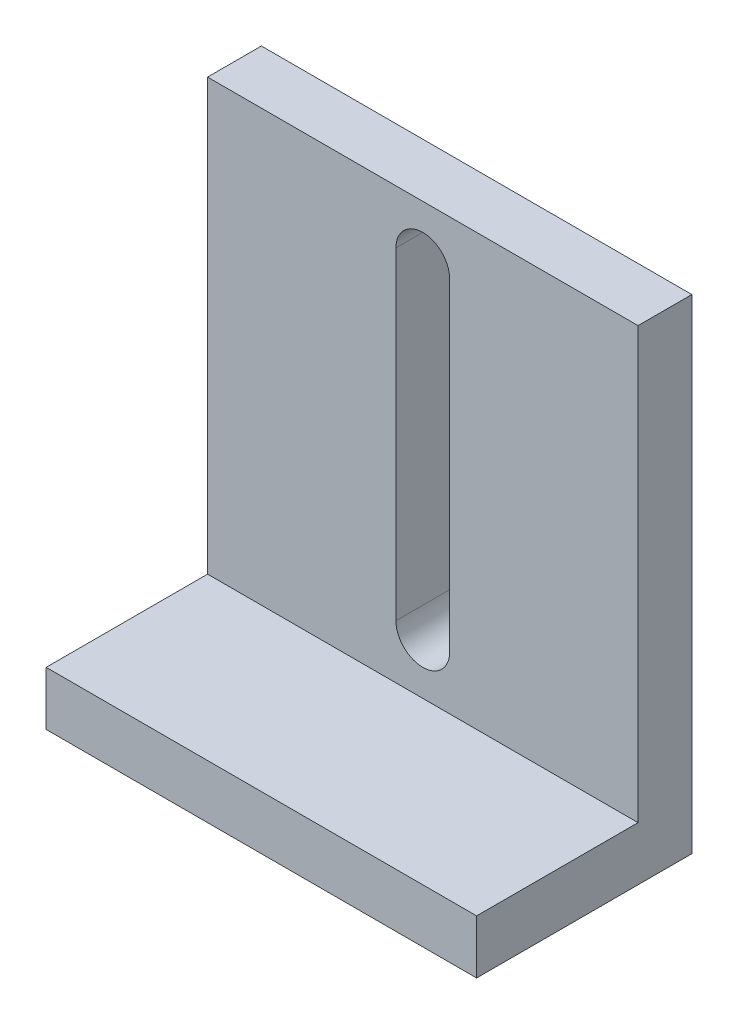
ISO-10303-21;
HEADER;
FILE_DESCRIPTION(('STEP AP214'),'2;1');
FILE_NAME('part.step','',(''),(''),'','','');
FILE_SCHEMA(('AUTOMOTIVE_DESIGN { 1 0 10303 214 1 1 1 1 }'));
ENDSEC;
DATA;
#1=APPLICATION_CONTEXT('core data for automotive mechanical design processes');
#2=APPLICATION_PROTOCOL_DEFINITION('international standard','automotive_design',2000,#1);
#3=PRODUCT_CONTEXT('',#1,'mechanical');
#4=PRODUCT('Part','Part','',(#3));
#5=PRODUCT_RELATED_PRODUCT_CATEGORY('part','',(#4));
#6=PRODUCT_DEFINITION_FORMATION('','',#4);
#7=PRODUCT_DEFINITION_CONTEXT('part definition',#1,'design');
#8=PRODUCT_DEFINITION('design','',#6,#7);
#9=PRODUCT_DEFINITION_SHAPE('','',#8);
#10=(LENGTH_UNIT() NAMED_UNIT(*) SI_UNIT(.MILLI.,.METRE.));
#11=(NAMED_UNIT(*) PLANE_ANGLE_UNIT() SI_UNIT($,.RADIAN.));
#12=(NAMED_UNIT(*) SI_UNIT($,.STERADIAN.) SOLID_ANGLE_UNIT());
#13=UNCERTAINTY_MEASURE_WITH_UNIT(LENGTH_MEASURE(1.E-05),#10,'distance_accuracy_value','');
#14=(GEOMETRIC_REPRESENTATION_CONTEXT(3) GLOBAL_UNCERTAINTY_ASSIGNED_CONTEXT((#13)) GLOBAL_UNIT_ASSIGNED_CONTEXT((#10,
#11,#12)) REPRESENTATION_CONTEXT('',''));
#15=CARTESIAN_POINT('',(0.,0.,0.));
#16=DIRECTION('',(0.,0.,1.));
#17=DIRECTION('',(1.,0.,0.));
#18=AXIS2_PLACEMENT_3D('',#15,#16,#17);
#19=CARTESIAN_POINT('',(-12.7,3.175,6.35));
#20=DIRECTION('',(1.,0.,0.));
#21=DIRECTION('',(0.,0.,-1.));
#22=AXIS2_PLACEMENT_3D('',#19,#20,#21);
#23=PLANE('',#22);
#24=DIRECTION('',(0.,0.,1.));
#25=VECTOR('',#24,1.);
#26=CARTESIAN_POINT('',(-12.7,0.,6.35));
#27=LINE('',#26,#25);
#28=CARTESIAN_POINT('',(-12.7,0.,-6.35));
#29=VERTEX_POINT('',#28);
#30=CARTESIAN_POINT('',(-12.7,0.,6.35));
#31=VERTEX_POINT('',#30);
#32=EDGE_CURVE('E164',#29,#31,#27,.T.);
#33=ORIENTED_EDGE('',*,*,#32,.T.);
#34=DIRECTION('',(0.,-1.,0.));
#35=VECTOR('',#34,1.);
#36=CARTESIAN_POINT('',(-12.7,3.175,6.35));
#37=LINE('',#36,#35);
#38=CARTESIAN_POINT('',(-12.7,3.175,6.35));
#39=VERTEX_POINT('',#38);
#40=EDGE_CURVE('E11',#39,#31,#37,.T.);
#41=ORIENTED_EDGE('',*,*,#40,.F.);
#42=DIRECTION('',(0.,0.,1.));
#43=VECTOR('',#42,1.);
#44=CARTESIAN_POINT('',(-12.7,3.175,6.35));
#45=LINE('',#44,#43);
#46=CARTESIAN_POINT('',(-12.7,3.175,-3.175));
#47=VERTEX_POINT('',#46);
#48=EDGE_CURVE('E165',#47,#39,#45,.T.);
#49=ORIENTED_EDGE('',*,*,#48,.F.);
#50=DIRECTION('',(0.,-1.,0.));
#51=VECTOR('',#50,1.);
#52=CARTESIAN_POINT('',(-12.7,28.575,-3.175));
#53=LINE('',#52,#51);
#54=CARTESIAN_POINT('',(-12.7,28.575,-3.175));
#55=VERTEX_POINT('',#54);
#56=EDGE_CURVE('E161',#55,#47,#53,.T.);
#57=ORIENTED_EDGE('',*,*,#56,.F.);
#58=DIRECTION('',(0.,0.,1.));
#59=VECTOR('',#58,1.);
#60=CARTESIAN_POINT('',(-12.7,28.575,-6.35));
#61=LINE('',#60,#59);
#62=CARTESIAN_POINT('',(-12.7,28.575,-6.35));
#63=VERTEX_POINT('',#62);
#64=EDGE_CURVE('E145',#63,#55,#61,.T.);
#65=ORIENTED_EDGE('',*,*,#64,.F.);
#66=DIRECTION('',(0.,-1.,0.));
#67=VECTOR('',#66,1.);
#68=CARTESIAN_POINT('',(-12.7,3.175,-6.35));
#69=LINE('',#68,#67);
#70=EDGE_CURVE('E172',#63,#29,#69,.T.);
#71=ORIENTED_EDGE('',*,*,#70,.T.);
#72=EDGE_LOOP('',(#33,#41,#49,#57,#65,#71));
#73=FACE_BOUND('',#72,.T.);
#74=ADVANCED_FACE('F32',(#73),#23,.F.);
#75=CARTESIAN_POINT('',(12.7,3.175,6.35));
#76=DIRECTION('',(0.,0.,-1.));
#77=DIRECTION('',(-1.,0.,0.));
#78=AXIS2_PLACEMENT_3D('',#75,#76,#77);
#79=PLANE('',#78);
#80=DIRECTION('',(1.,0.,0.));
#81=VECTOR('',#80,1.);
#82=CARTESIAN_POINT('',(12.7,0.,6.35));
#83=LINE('',#82,#81);
#84=CARTESIAN_POINT('',(12.7,0.,6.35));
#85=VERTEX_POINT('',#84);
#86=EDGE_CURVE('E175',#31,#85,#83,.T.);
#87=ORIENTED_EDGE('',*,*,#86,.T.);
#88=DIRECTION('',(0.,-1.,0.));
#89=VECTOR('',#88,1.);
#90=CARTESIAN_POINT('',(12.7,3.175,6.35));
#91=LINE('',#90,#89);
#92=CARTESIAN_POINT('',(12.7,3.175,6.35));
#93=VERTEX_POINT('',#92);
#94=EDGE_CURVE('E39',#93,#85,#91,.T.);
#95=ORIENTED_EDGE('',*,*,#94,.F.);
#96=DIRECTION('',(1.,0.,0.));
#97=VECTOR('',#96,1.);
#98=CARTESIAN_POINT('',(12.7,3.175,6.35));
#99=LINE('',#98,#97);
#100=EDGE_CURVE('E167',#39,#93,#99,.T.);
#101=ORIENTED_EDGE('',*,*,#100,.F.);
#102=ORIENTED_EDGE('',*,*,#40,.T.);
#103=EDGE_LOOP('',(#87,#95,#101,#102));
#104=FACE_BOUND('',#103,.T.);
#105=ADVANCED_FACE('F210',(#104),#79,.F.);
#106=CARTESIAN_POINT('',(12.7,3.175,6.35));
#107=DIRECTION('',(-1.,0.,0.));
#108=DIRECTION('',(0.,0.,1.));
#109=AXIS2_PLACEMENT_3D('',#106,#107,#108);
#110=PLANE('',#109);
#111=DIRECTION('',(0.,0.,-1.));
#112=VECTOR('',#111,1.);
#113=CARTESIAN_POINT('',(12.7,0.,6.35));
#114=LINE('',#113,#112);
#115=CARTESIAN_POINT('',(12.7,0.,-6.35));
#116=VERTEX_POINT('',#115);
#117=EDGE_CURVE('E177',#85,#116,#114,.T.);
#118=ORIENTED_EDGE('',*,*,#117,.T.);
#119=DIRECTION('',(0.,-1.,0.));
#120=VECTOR('',#119,1.);
#121=CARTESIAN_POINT('',(12.7,3.175,-6.35));
#122=LINE('',#121,#120);
#123=CARTESIAN_POINT('',(12.7,28.575,-6.35));
#124=VERTEX_POINT('',#123);
#125=EDGE_CURVE('E182',#124,#116,#122,.T.);
#126=ORIENTED_EDGE('',*,*,#125,.F.);
#127=DIRECTION('',(0.,0.,-1.));
#128=VECTOR('',#127,1.);
#129=CARTESIAN_POINT('',(12.7,28.575,-6.35));
#130=LINE('',#129,#128);
#131=CARTESIAN_POINT('',(12.7,28.575,-3.175));
#132=VERTEX_POINT('',#131);
#133=EDGE_CURVE('E150',#132,#124,#130,.T.);
#134=ORIENTED_EDGE('',*,*,#133,.F.);
#135=DIRECTION('',(0.,-1.,0.));
#136=VECTOR('',#135,1.);
#137=CARTESIAN_POINT('',(12.7,28.575,-3.175));
#138=LINE('',#137,#136);
#139=CARTESIAN_POINT('',(12.7,3.175,-3.175));
#140=VERTEX_POINT('',#139);
#141=EDGE_CURVE('E156',#132,#140,#138,.T.);
#142=ORIENTED_EDGE('',*,*,#141,.T.);
#143=DIRECTION('',(0.,0.,-1.));
#144=VECTOR('',#143,1.);
#145=CARTESIAN_POINT('',(12.7,3.175,6.35));
#146=LINE('',#145,#144);
#147=EDGE_CURVE('E170',#93,#140,#146,.T.);
#148=ORIENTED_EDGE('',*,*,#147,.F.);
#149=ORIENTED_EDGE('',*,*,#94,.T.);
#150=EDGE_LOOP('',(#118,#126,#134,#142,#148,#149));
#151=FACE_BOUND('',#150,.T.);
#152=ADVANCED_FACE('F189',(#151),#110,.F.);
#153=CARTESIAN_POINT('',(12.7,3.175,-6.35));
#154=DIRECTION('',(0.,0.,1.));
#155=DIRECTION('',(1.,0.,0.));
#156=AXIS2_PLACEMENT_3D('',#153,#154,#155);
#157=PLANE('',#156);
#158=DIRECTION('',(0.,1.,0.));
#159=VECTOR('',#158,1.);
#160=CARTESIAN_POINT('',(1.5875,25.4,-6.35));
#161=LINE('',#160,#159);
#162=CARTESIAN_POINT('',(1.5875,6.35,-6.35));
#163=VERTEX_POINT('',#162);
#164=CARTESIAN_POINT('',(1.5875,25.4,-6.35));
#165=VERTEX_POINT('',#164);
#166=EDGE_CURVE('E116',#163,#165,#161,.T.);
#167=ORIENTED_EDGE('',*,*,#166,.T.);
#168=CARTESIAN_POINT('',(0.,25.4,-6.35));
#169=DIRECTION('',(0.,0.,1.));
#170=DIRECTION('',(1.,0.,0.));
#171=AXIS2_PLACEMENT_3D('',#168,#169,#170);
#172=CIRCLE('',#171,1.5875);
#173=CARTESIAN_POINT('',(-1.5875,25.4,-6.35));
#174=VERTEX_POINT('',#173);
#175=EDGE_CURVE('E110',#165,#174,#172,.T.);
#176=ORIENTED_EDGE('',*,*,#175,.T.);
#177=DIRECTION('',(0.,-1.,0.));
#178=VECTOR('',#177,1.);
#179=CARTESIAN_POINT('',(-1.5875,25.4,-6.35));
#180=LINE('',#179,#178);
#181=CARTESIAN_POINT('',(-1.5875,6.35,-6.35));
#182=VERTEX_POINT('',#181);
#183=EDGE_CURVE('E119',#174,#182,#180,.T.);
#184=ORIENTED_EDGE('',*,*,#183,.T.);
#185=CARTESIAN_POINT('',(0.,6.35,-6.35));
#186=DIRECTION('',(0.,0.,1.));
#187=DIRECTION('',(1.,0.,0.));
#188=AXIS2_PLACEMENT_3D('',#185,#186,#187);
#189=CIRCLE('',#188,1.5875);
#190=EDGE_CURVE('E46',#182,#163,#189,.T.);
#191=ORIENTED_EDGE('',*,*,#190,.T.);
#192=EDGE_LOOP('',(#167,#176,#184,#191));
#193=FACE_BOUND('',#192,.T.);
#194=DIRECTION('',(-1.,0.,0.));
#195=VECTOR('',#194,1.);
#196=CARTESIAN_POINT('',(12.7,0.,-6.35));
#197=LINE('',#196,#195);
#198=EDGE_CURVE('E168',#116,#29,#197,.T.);
#199=ORIENTED_EDGE('',*,*,#198,.T.);
#200=ORIENTED_EDGE('',*,*,#70,.F.);
#201=DIRECTION('',(-1.,0.,0.));
#202=VECTOR('',#201,1.);
#203=CARTESIAN_POINT('',(-12.7,28.575,-6.35));
#204=LINE('',#203,#202);
#205=EDGE_CURVE('E153',#124,#63,#204,.T.);
#206=ORIENTED_EDGE('',*,*,#205,.F.);
#207=ORIENTED_EDGE('',*,*,#125,.T.);
#208=EDGE_LOOP('',(#199,#200,#206,#207));
#209=FACE_BOUND('',#208,.T.);
#210=ADVANCED_FACE('F123',(#193,#209),#157,.F.);
#211=CARTESIAN_POINT('',(0.,3.175,0.));
#212=DIRECTION('',(0.,1.,0.));
#213=DIRECTION('',(0.,0.,1.));
#214=AXIS2_PLACEMENT_3D('',#211,#212,#213);
#215=PLANE('',#214);
#216=DIRECTION('',(1.,0.,0.));
#217=VECTOR('',#216,1.);
#218=CARTESIAN_POINT('',(-12.7,3.175,-3.175));
#219=LINE('',#218,#217);
#220=EDGE_CURVE('E141',#47,#140,#219,.T.);
#221=ORIENTED_EDGE('',*,*,#220,.F.);
#222=ORIENTED_EDGE('',*,*,#48,.T.);
#223=ORIENTED_EDGE('',*,*,#100,.T.);
#224=ORIENTED_EDGE('',*,*,#147,.T.);
#225=EDGE_LOOP('',(#221,#222,#223,#224));
#226=FACE_BOUND('',#225,.T.);
#227=ADVANCED_FACE('F209',(#226),#215,.T.);
#228=CARTESIAN_POINT('',(0.,0.,0.));
#229=DIRECTION('',(0.,1.,0.));
#230=DIRECTION('',(0.,0.,1.));
#231=AXIS2_PLACEMENT_3D('',#228,#229,#230);
#232=PLANE('',#231);
#233=ORIENTED_EDGE('',*,*,#32,.F.);
#234=ORIENTED_EDGE('',*,*,#198,.F.);
#235=ORIENTED_EDGE('',*,*,#117,.F.);
#236=ORIENTED_EDGE('',*,*,#86,.F.);
#237=EDGE_LOOP('',(#233,#234,#235,#236));
#238=FACE_BOUND('',#237,.T.);
#239=ADVANCED_FACE('F195',(#238),#232,.F.);
#240=CARTESIAN_POINT('',(-12.7,28.575,-3.175));
#241=DIRECTION('',(0.,0.,-1.));
#242=DIRECTION('',(-1.,0.,0.));
#243=AXIS2_PLACEMENT_3D('',#240,#241,#242);
#244=PLANE('',#243);
#245=DIRECTION('',(0.,-1.,0.));
#246=VECTOR('',#245,1.);
#247=CARTESIAN_POINT('',(-1.5875,25.4,-3.175));
#248=LINE('',#247,#246);
#249=CARTESIAN_POINT('',(-1.5875,25.4,-3.175));
#250=VERTEX_POINT('',#249);
#251=CARTESIAN_POINT('',(-1.5875,6.35,-3.175));
#252=VERTEX_POINT('',#251);
#253=EDGE_CURVE('E135',#250,#252,#248,.T.);
#254=ORIENTED_EDGE('',*,*,#253,.F.);
#255=CARTESIAN_POINT('',(0.,25.4,-3.175));
#256=DIRECTION('',(0.,0.,1.));
#257=DIRECTION('',(1.,0.,0.));
#258=AXIS2_PLACEMENT_3D('',#255,#256,#257);
#259=CIRCLE('',#258,1.5875);
#260=CARTESIAN_POINT('',(1.5875,25.4,-3.175));
#261=VERTEX_POINT('',#260);
#262=EDGE_CURVE('E54',#261,#250,#259,.T.);
#263=ORIENTED_EDGE('',*,*,#262,.F.);
#264=DIRECTION('',(0.,1.,0.));
#265=VECTOR('',#264,1.);
#266=CARTESIAN_POINT('',(1.5875,25.4,-3.175));
#267=LINE('',#266,#265);
#268=CARTESIAN_POINT('',(1.5875,6.35,-3.175));
#269=VERTEX_POINT('',#268);
#270=EDGE_CURVE('E126',#269,#261,#267,.T.);
#271=ORIENTED_EDGE('',*,*,#270,.F.);
#272=CARTESIAN_POINT('',(0.,6.35,-3.175));
#273=DIRECTION('',(0.,0.,1.));
#274=DIRECTION('',(1.,0.,0.));
#275=AXIS2_PLACEMENT_3D('',#272,#273,#274);
#276=CIRCLE('',#275,1.5875);
#277=EDGE_CURVE('E129',#252,#269,#276,.T.);
#278=ORIENTED_EDGE('',*,*,#277,.F.);
#279=EDGE_LOOP('',(#254,#263,#271,#278));
#280=FACE_BOUND('',#279,.T.);
#281=ORIENTED_EDGE('',*,*,#220,.T.);
#282=ORIENTED_EDGE('',*,*,#141,.F.);
#283=DIRECTION('',(1.,0.,0.));
#284=VECTOR('',#283,1.);
#285=CARTESIAN_POINT('',(-12.7,28.575,-3.175));
#286=LINE('',#285,#284);
#287=EDGE_CURVE('E148',#55,#132,#286,.T.);
#288=ORIENTED_EDGE('',*,*,#287,.F.);
#289=ORIENTED_EDGE('',*,*,#56,.T.);
#290=EDGE_LOOP('',(#281,#282,#288,#289));
#291=FACE_BOUND('',#290,.T.);
#292=ADVANCED_FACE('F207',(#280,#291),#244,.F.);
#293=CARTESIAN_POINT('',(0.,28.575,0.));
#294=DIRECTION('',(0.,1.,0.));
#295=DIRECTION('',(0.,0.,1.));
#296=AXIS2_PLACEMENT_3D('',#293,#294,#295);
#297=PLANE('',#296);
#298=ORIENTED_EDGE('',*,*,#64,.T.);
#299=ORIENTED_EDGE('',*,*,#287,.T.);
#300=ORIENTED_EDGE('',*,*,#133,.T.);
#301=ORIENTED_EDGE('',*,*,#205,.T.);
#302=EDGE_LOOP('',(#298,#299,#300,#301));
#303=FACE_BOUND('',#302,.T.);
#304=ADVANCED_FACE('F203',(#303),#297,.T.);
#305=CARTESIAN_POINT('',(0.,25.4,-6.35));
#306=DIRECTION('',(0.,0.,1.));
#307=DIRECTION('',(1.,0.,0.));
#308=AXIS2_PLACEMENT_3D('',#305,#306,#307);
#309=CYLINDRICAL_SURFACE('',#308,1.5875);
#310=ORIENTED_EDGE('',*,*,#262,.T.);
#311=DIRECTION('',(0.,0.,1.));
#312=VECTOR('',#311,1.);
#313=CARTESIAN_POINT('',(-1.5875,25.4,-6.35));
#314=LINE('',#313,#312);
#315=EDGE_CURVE('E106',#174,#250,#314,.T.);
#316=ORIENTED_EDGE('',*,*,#315,.F.);
#317=ORIENTED_EDGE('',*,*,#175,.F.);
#318=DIRECTION('',(0.,0.,1.));
#319=VECTOR('',#318,1.);
#320=CARTESIAN_POINT('',(1.5875,25.4,-6.35));
#321=LINE('',#320,#319);
#322=EDGE_CURVE('E139',#165,#261,#321,.T.);
#323=ORIENTED_EDGE('',*,*,#322,.T.);
#324=EDGE_LOOP('',(#310,#316,#317,#323));
#325=FACE_BOUND('',#324,.T.);
#326=ADVANCED_FACE('F108',(#325),#309,.F.);
#327=CARTESIAN_POINT('',(1.5875,25.4,-6.35));
#328=DIRECTION('',(1.,0.,0.));
#329=DIRECTION('',(0.,1.,0.));
#330=AXIS2_PLACEMENT_3D('',#327,#328,#329);
#331=PLANE('',#330);
#332=ORIENTED_EDGE('',*,*,#270,.T.);
#333=ORIENTED_EDGE('',*,*,#322,.F.);
#334=ORIENTED_EDGE('',*,*,#166,.F.);
#335=DIRECTION('',(0.,0.,1.));
#336=VECTOR('',#335,1.);
#337=CARTESIAN_POINT('',(1.5875,6.35,-6.35));
#338=LINE('',#337,#336);
#339=EDGE_CURVE('E142',#163,#269,#338,.T.);
#340=ORIENTED_EDGE('',*,*,#339,.T.);
#341=EDGE_LOOP('',(#332,#333,#334,#340));
#342=FACE_BOUND('',#341,.T.);
#343=ADVANCED_FACE('F231',(#342),#331,.F.);
#344=CARTESIAN_POINT('',(0.,6.35,-6.35));
#345=DIRECTION('',(0.,0.,1.));
#346=DIRECTION('',(1.,0.,0.));
#347=AXIS2_PLACEMENT_3D('',#344,#345,#346);
#348=CYLINDRICAL_SURFACE('',#347,1.5875);
#349=ORIENTED_EDGE('',*,*,#277,.T.);
#350=ORIENTED_EDGE('',*,*,#339,.F.);
#351=ORIENTED_EDGE('',*,*,#190,.F.);
#352=DIRECTION('',(0.,0.,1.));
#353=VECTOR('',#352,1.);
#354=CARTESIAN_POINT('',(-1.5875,6.35,-6.35));
#355=LINE('',#354,#353);
#356=EDGE_CURVE('E115',#182,#252,#355,.T.);
#357=ORIENTED_EDGE('',*,*,#356,.T.);
#358=EDGE_LOOP('',(#349,#350,#351,#357));
#359=FACE_BOUND('',#358,.T.);
#360=ADVANCED_FACE('F234',(#359),#348,.F.);
#361=CARTESIAN_POINT('',(-1.5875,25.4,-6.35));
#362=DIRECTION('',(-1.,0.,0.));
#363=DIRECTION('',(0.,-1.,0.));
#364=AXIS2_PLACEMENT_3D('',#361,#362,#363);
#365=PLANE('',#364);
#366=ORIENTED_EDGE('',*,*,#253,.T.);
#367=ORIENTED_EDGE('',*,*,#356,.F.);
#368=ORIENTED_EDGE('',*,*,#183,.F.);
#369=ORIENTED_EDGE('',*,*,#315,.T.);
#370=EDGE_LOOP('',(#366,#367,#368,#369));
#371=FACE_BOUND('',#370,.T.);
#372=ADVANCED_FACE('F120',(#371),#365,.F.);
#373=CLOSED_SHELL('',(#74,#105,#152,#210,#227,#239,#292,#304,#326,#343,#360,#372));
#374=MANIFOLD_SOLID_BREP('B2',#373);
#375=ADVANCED_BREP_SHAPE_REPRESENTATION('',(#18,#374),#14);
#376=SHAPE_DEFINITION_REPRESENTATION(#9,#375);
ENDSEC;
END-ISO-10303-21;
